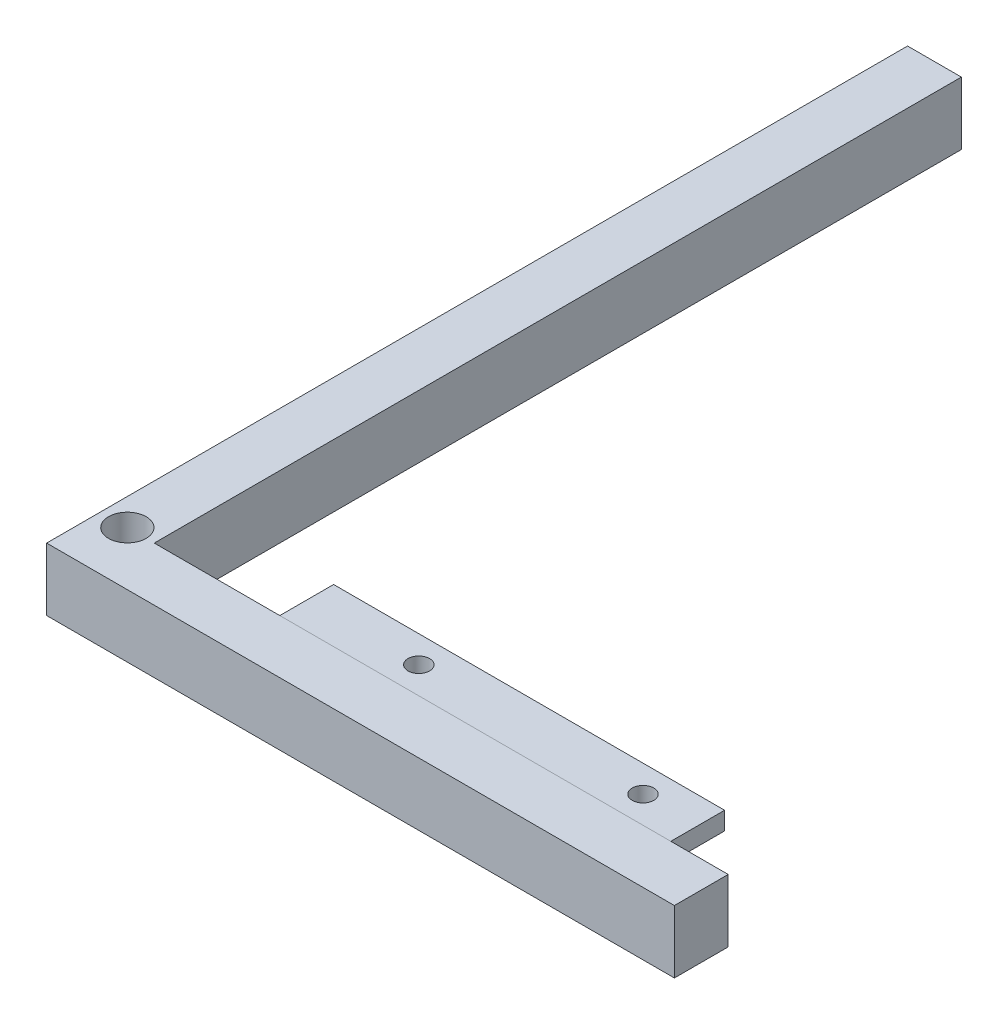
ISO-10303-21;
HEADER;
FILE_DESCRIPTION(('STEP AP214'),'2;1');
FILE_NAME('part.step','',(''),(''),'','','');
FILE_SCHEMA(('AUTOMOTIVE_DESIGN { 1 0 10303 214 1 1 1 1 }'));
ENDSEC;
DATA;
#1=APPLICATION_CONTEXT('core data for automotive mechanical design processes');
#2=APPLICATION_PROTOCOL_DEFINITION('international standard','automotive_design',2000,#1);
#3=PRODUCT_CONTEXT('',#1,'mechanical');
#4=PRODUCT('Part','Part','',(#3));
#5=PRODUCT_RELATED_PRODUCT_CATEGORY('part','',(#4));
#6=PRODUCT_DEFINITION_FORMATION('','',#4);
#7=PRODUCT_DEFINITION_CONTEXT('part definition',#1,'design');
#8=PRODUCT_DEFINITION('design','',#6,#7);
#9=PRODUCT_DEFINITION_SHAPE('','',#8);
#10=(LENGTH_UNIT() NAMED_UNIT(*) SI_UNIT(.MILLI.,.METRE.));
#11=(NAMED_UNIT(*) PLANE_ANGLE_UNIT() SI_UNIT($,.RADIAN.));
#12=(NAMED_UNIT(*) SI_UNIT($,.STERADIAN.) SOLID_ANGLE_UNIT());
#13=UNCERTAINTY_MEASURE_WITH_UNIT(LENGTH_MEASURE(1.E-05),#10,'distance_accuracy_value','');
#14=(GEOMETRIC_REPRESENTATION_CONTEXT(3) GLOBAL_UNCERTAINTY_ASSIGNED_CONTEXT((#13)) GLOBAL_UNIT_ASSIGNED_CONTEXT((#10,
#11,#12)) REPRESENTATION_CONTEXT('',''));
#15=CARTESIAN_POINT('',(0.,0.,0.));
#16=DIRECTION('',(0.,0.,1.));
#17=DIRECTION('',(1.,0.,0.));
#18=AXIS2_PLACEMENT_3D('',#15,#16,#17);
#19=CARTESIAN_POINT('',(0.,2.5,0.));
#20=DIRECTION('',(0.,-1.,0.));
#21=DIRECTION('',(0.,0.,-1.));
#22=AXIS2_PLACEMENT_3D('',#19,#20,#21);
#23=PLANE('',#22);
#24=CARTESIAN_POINT('',(-1.24999999999997,2.5,-3.00000089383693));
#25=DIRECTION('',(0.,-1.,0.));
#26=DIRECTION('',(0.,0.,-1.));
#27=AXIS2_PLACEMENT_3D('',#24,#25,#26);
#28=CIRCLE('',#27,0.6);
#29=CARTESIAN_POINT('',(-1.24999999999997,2.5,-3.60000089383693));
#30=VERTEX_POINT('',#29);
#31=EDGE_CURVE('E145',#30,#30,#28,.T.);
#32=ORIENTED_EDGE('',*,*,#31,.F.);
#33=EDGE_LOOP('',(#32));
#34=FACE_BOUND('',#33,.T.);
#35=DIRECTION('',(0.,0.,-1.));
#36=VECTOR('',#35,1.);
#37=CARTESIAN_POINT('',(-7.50000000000001,2.5,0.));
#38=LINE('',#37,#36);
#39=CARTESIAN_POINT('',(-7.50000000000001,2.5,-1.5));
#40=VERTEX_POINT('',#39);
#41=CARTESIAN_POINT('',(-7.50000000000001,2.5,-4.5));
#42=VERTEX_POINT('',#41);
#43=EDGE_CURVE('E129',#40,#42,#38,.T.);
#44=ORIENTED_EDGE('',*,*,#43,.T.);
#45=DIRECTION('',(1.,0.,0.));
#46=VECTOR('',#45,1.);
#47=CARTESIAN_POINT('',(0.,2.5,-4.5));
#48=LINE('',#47,#46);
#49=CARTESIAN_POINT('',(14.3,2.5,-4.5));
#50=VERTEX_POINT('',#49);
#51=EDGE_CURVE('E121',#42,#50,#48,.T.);
#52=ORIENTED_EDGE('',*,*,#51,.T.);
#53=DIRECTION('',(0.,0.,-1.));
#54=VECTOR('',#53,1.);
#55=CARTESIAN_POINT('',(14.3,2.5,0.));
#56=LINE('',#55,#54);
#57=CARTESIAN_POINT('',(14.3,2.5,-1.5));
#58=VERTEX_POINT('',#57);
#59=EDGE_CURVE('E128',#58,#50,#56,.T.);
#60=ORIENTED_EDGE('',*,*,#59,.F.);
#61=DIRECTION('',(1.,0.,0.));
#62=VECTOR('',#61,1.);
#63=CARTESIAN_POINT('',(0.,2.5,-1.5));
#64=LINE('',#63,#62);
#65=EDGE_CURVE('E138',#40,#58,#64,.T.);
#66=ORIENTED_EDGE('',*,*,#65,.F.);
#67=EDGE_LOOP('',(#44,#52,#60,#66));
#68=FACE_BOUND('',#67,.T.);
#69=CARTESIAN_POINT('',(11.25,2.5,-3.00000089383693));
#70=DIRECTION('',(0.,-1.,0.));
#71=DIRECTION('',(0.,0.,-1.));
#72=AXIS2_PLACEMENT_3D('',#69,#70,#71);
#73=CIRCLE('',#72,0.6);
#74=CARTESIAN_POINT('',(11.25,2.5,-3.60000089383693));
#75=VERTEX_POINT('',#74);
#76=EDGE_CURVE('E158',#75,#75,#73,.T.);
#77=ORIENTED_EDGE('',*,*,#76,.F.);
#78=EDGE_LOOP('',(#77));
#79=FACE_BOUND('',#78,.T.);
#80=ADVANCED_FACE('F79',(#34,#68,#79),#23,.T.);
#81=CARTESIAN_POINT('',(0.,3.5,0.));
#82=DIRECTION('',(0.,-1.,0.));
#83=DIRECTION('',(0.,0.,-1.));
#84=AXIS2_PLACEMENT_3D('',#81,#82,#83);
#85=PLANE('',#84);
#86=DIRECTION('',(0.,0.,-1.));
#87=VECTOR('',#86,1.);
#88=CARTESIAN_POINT('',(-7.50000000000001,3.5,0.));
#89=LINE('',#88,#87);
#90=CARTESIAN_POINT('',(-7.50000000000001,3.5,-1.5));
#91=VERTEX_POINT('',#90);
#92=CARTESIAN_POINT('',(-7.50000000000001,3.5,-4.5));
#93=VERTEX_POINT('',#92);
#94=EDGE_CURVE('E143',#91,#93,#89,.T.);
#95=ORIENTED_EDGE('',*,*,#94,.F.);
#96=DIRECTION('',(1.,0.,0.));
#97=VECTOR('',#96,1.);
#98=CARTESIAN_POINT('',(0.,3.5,-1.5));
#99=LINE('',#98,#97);
#100=CARTESIAN_POINT('',(14.3,3.5,-1.5));
#101=VERTEX_POINT('',#100);
#102=EDGE_CURVE('E149',#91,#101,#99,.T.);
#103=ORIENTED_EDGE('',*,*,#102,.T.);
#104=DIRECTION('',(0.,0.,-1.));
#105=VECTOR('',#104,1.);
#106=CARTESIAN_POINT('',(14.3,3.5,0.));
#107=LINE('',#106,#105);
#108=CARTESIAN_POINT('',(14.3,3.5,-4.5));
#109=VERTEX_POINT('',#108);
#110=EDGE_CURVE('E147',#101,#109,#107,.T.);
#111=ORIENTED_EDGE('',*,*,#110,.T.);
#112=DIRECTION('',(1.,0.,0.));
#113=VECTOR('',#112,1.);
#114=CARTESIAN_POINT('',(0.,3.5,-4.5));
#115=LINE('',#114,#113);
#116=EDGE_CURVE('E134',#93,#109,#115,.T.);
#117=ORIENTED_EDGE('',*,*,#116,.F.);
#118=EDGE_LOOP('',(#95,#103,#111,#117));
#119=FACE_BOUND('',#118,.T.);
#120=CARTESIAN_POINT('',(-1.24999999999997,3.5,-3.00000089383693));
#121=DIRECTION('',(0.,-1.,0.));
#122=DIRECTION('',(0.,0.,-1.));
#123=AXIS2_PLACEMENT_3D('',#120,#121,#122);
#124=CIRCLE('',#123,0.6);
#125=CARTESIAN_POINT('',(-1.24999999999997,3.5,-3.60000089383693));
#126=VERTEX_POINT('',#125);
#127=EDGE_CURVE('E155',#126,#126,#124,.T.);
#128=ORIENTED_EDGE('',*,*,#127,.T.);
#129=EDGE_LOOP('',(#128));
#130=FACE_BOUND('',#129,.T.);
#131=CARTESIAN_POINT('',(11.25,3.5,-3.00000089383693));
#132=DIRECTION('',(0.,-1.,0.));
#133=DIRECTION('',(0.,0.,-1.));
#134=AXIS2_PLACEMENT_3D('',#131,#132,#133);
#135=CIRCLE('',#134,0.6);
#136=CARTESIAN_POINT('',(11.25,3.5,-3.60000089383693));
#137=VERTEX_POINT('',#136);
#138=EDGE_CURVE('E161',#137,#137,#135,.T.);
#139=ORIENTED_EDGE('',*,*,#138,.T.);
#140=EDGE_LOOP('',(#139));
#141=FACE_BOUND('',#140,.T.);
#142=ADVANCED_FACE('F170',(#119,#130,#141),#85,.F.);
#143=CARTESIAN_POINT('',(-7.50000000000001,2.5,0.));
#144=DIRECTION('',(1.,0.,0.));
#145=DIRECTION('',(0.,0.,-1.));
#146=AXIS2_PLACEMENT_3D('',#143,#144,#145);
#147=PLANE('',#146);
#148=ORIENTED_EDGE('',*,*,#94,.T.);
#149=DIRECTION('',(0.,1.,0.));
#150=VECTOR('',#149,1.);
#151=CARTESIAN_POINT('',(-7.50000000000001,2.5,-4.5));
#152=LINE('',#151,#150);
#153=EDGE_CURVE('E13',#42,#93,#152,.T.);
#154=ORIENTED_EDGE('',*,*,#153,.F.);
#155=ORIENTED_EDGE('',*,*,#43,.F.);
#156=DIRECTION('',(0.,1.,0.));
#157=VECTOR('',#156,1.);
#158=CARTESIAN_POINT('',(-7.50000000000001,2.5,-1.5));
#159=LINE('',#158,#157);
#160=EDGE_CURVE('E96',#40,#91,#159,.T.);
#161=ORIENTED_EDGE('',*,*,#160,.T.);
#162=EDGE_LOOP('',(#148,#154,#155,#161));
#163=FACE_BOUND('',#162,.T.);
#164=ADVANCED_FACE('F81',(#163),#147,.F.);
#165=CARTESIAN_POINT('',(0.,2.5,-4.5));
#166=DIRECTION('',(0.,0.,1.));
#167=DIRECTION('',(1.,0.,0.));
#168=AXIS2_PLACEMENT_3D('',#165,#166,#167);
#169=PLANE('',#168);
#170=ORIENTED_EDGE('',*,*,#116,.T.);
#171=DIRECTION('',(0.,1.,0.));
#172=VECTOR('',#171,1.);
#173=CARTESIAN_POINT('',(14.3,2.5,-4.5));
#174=LINE('',#173,#172);
#175=EDGE_CURVE('E88',#50,#109,#174,.T.);
#176=ORIENTED_EDGE('',*,*,#175,.F.);
#177=ORIENTED_EDGE('',*,*,#51,.F.);
#178=ORIENTED_EDGE('',*,*,#153,.T.);
#179=EDGE_LOOP('',(#170,#176,#177,#178));
#180=FACE_BOUND('',#179,.T.);
#181=ADVANCED_FACE('F133',(#180),#169,.F.);
#182=CARTESIAN_POINT('',(14.3,2.5,0.));
#183=DIRECTION('',(1.,0.,0.));
#184=DIRECTION('',(0.,0.,-1.));
#185=AXIS2_PLACEMENT_3D('',#182,#183,#184);
#186=PLANE('',#185);
#187=ORIENTED_EDGE('',*,*,#110,.F.);
#188=DIRECTION('',(0.,1.,0.));
#189=VECTOR('',#188,1.);
#190=CARTESIAN_POINT('',(14.3,2.5,-1.5));
#191=LINE('',#190,#189);
#192=EDGE_CURVE('E110',#58,#101,#191,.T.);
#193=ORIENTED_EDGE('',*,*,#192,.F.);
#194=ORIENTED_EDGE('',*,*,#59,.T.);
#195=ORIENTED_EDGE('',*,*,#175,.T.);
#196=EDGE_LOOP('',(#187,#193,#194,#195));
#197=FACE_BOUND('',#196,.T.);
#198=ADVANCED_FACE('F137',(#197),#186,.T.);
#199=CARTESIAN_POINT('',(0.,2.5,-1.5));
#200=DIRECTION('',(0.,0.,1.));
#201=DIRECTION('',(1.,0.,0.));
#202=AXIS2_PLACEMENT_3D('',#199,#200,#201);
#203=PLANE('',#202);
#204=ORIENTED_EDGE('',*,*,#102,.F.);
#205=ORIENTED_EDGE('',*,*,#160,.F.);
#206=ORIENTED_EDGE('',*,*,#65,.T.);
#207=ORIENTED_EDGE('',*,*,#192,.T.);
#208=EDGE_LOOP('',(#204,#205,#206,#207));
#209=FACE_BOUND('',#208,.T.);
#210=ADVANCED_FACE('F182',(#209),#203,.T.);
#211=CARTESIAN_POINT('',(-1.24999999999997,2.5,-3.00000089383693));
#212=DIRECTION('',(0.,1.,0.));
#213=DIRECTION('',(0.,0.,1.));
#214=AXIS2_PLACEMENT_3D('',#211,#212,#213);
#215=CYLINDRICAL_SURFACE('',#214,0.6);
#216=ORIENTED_EDGE('',*,*,#31,.T.);
#217=EDGE_LOOP('',(#216));
#218=FACE_BOUND('',#217,.T.);
#219=ORIENTED_EDGE('',*,*,#127,.F.);
#220=EDGE_LOOP('',(#219));
#221=FACE_BOUND('',#220,.T.);
#222=ADVANCED_FACE('F179',(#218,#221),#215,.F.);
#223=CARTESIAN_POINT('',(11.25,2.5,-3.00000089383693));
#224=DIRECTION('',(0.,1.,0.));
#225=DIRECTION('',(0.,0.,1.));
#226=AXIS2_PLACEMENT_3D('',#223,#224,#225);
#227=CYLINDRICAL_SURFACE('',#226,0.6);
#228=ORIENTED_EDGE('',*,*,#76,.T.);
#229=EDGE_LOOP('',(#228));
#230=FACE_BOUND('',#229,.T.);
#231=ORIENTED_EDGE('',*,*,#138,.F.);
#232=EDGE_LOOP('',(#231));
#233=FACE_BOUND('',#232,.T.);
#234=ADVANCED_FACE('F167',(#230,#233),#227,.F.);
#235=CLOSED_SHELL('',(#80,#142,#164,#181,#198,#210,#222,#234));
#236=MANIFOLD_SOLID_BREP('B2',#235);
#237=CARTESIAN_POINT('',(-16.,0.,-1.5));
#238=DIRECTION('',(0.,1.,0.));
#239=DIRECTION('',(0.,0.,1.));
#240=AXIS2_PLACEMENT_3D('',#237,#238,#239);
#241=CYLINDRICAL_SURFACE('',#240,0.6);
#242=CARTESIAN_POINT('',(-16.,0.,-1.5));
#243=DIRECTION('',(0.,1.,0.));
#244=DIRECTION('',(0.,0.,1.));
#245=AXIS2_PLACEMENT_3D('',#242,#243,#244);
#246=CIRCLE('',#245,0.6);
#247=CARTESIAN_POINT('',(-16.,0.,-0.9));
#248=VERTEX_POINT('',#247);
#249=EDGE_CURVE('E401',#248,#248,#246,.T.);
#250=ORIENTED_EDGE('',*,*,#249,.F.);
#251=EDGE_LOOP('',(#250));
#252=FACE_BOUND('',#251,.T.);
#253=CARTESIAN_POINT('',(-16.,2.,-1.5));
#254=DIRECTION('',(0.,1.,0.));
#255=DIRECTION('',(0.,0.,1.));
#256=AXIS2_PLACEMENT_3D('',#253,#254,#255);
#257=CIRCLE('',#256,0.6);
#258=CARTESIAN_POINT('',(-16.,2.,-0.9));
#259=VERTEX_POINT('',#258);
#260=EDGE_CURVE('E277',#259,#259,#257,.F.);
#261=ORIENTED_EDGE('',*,*,#260,.F.);
#262=EDGE_LOOP('',(#261));
#263=FACE_BOUND('',#262,.T.);
#264=ADVANCED_FACE('F273',(#252,#263),#241,.F.);
#265=CARTESIAN_POINT('',(-17.5,3.5,1.5));
#266=DIRECTION('',(-1.,0.,0.));
#267=DIRECTION('',(0.,0.,1.));
#268=AXIS2_PLACEMENT_3D('',#265,#266,#267);
#269=PLANE('',#268);
#270=DIRECTION('',(0.,0.,-1.));
#271=VECTOR('',#270,1.);
#272=CARTESIAN_POINT('',(-17.5,0.,1.5));
#273=LINE('',#272,#271);
#274=CARTESIAN_POINT('',(-17.5,0.,1.5));
#275=VERTEX_POINT('',#274);
#276=CARTESIAN_POINT('',(-17.5,0.,-46.5000000000001));
#277=VERTEX_POINT('',#276);
#278=EDGE_CURVE('E458',#275,#277,#273,.T.);
#279=ORIENTED_EDGE('',*,*,#278,.F.);
#280=DIRECTION('',(0.,-1.,0.));
#281=VECTOR('',#280,1.);
#282=CARTESIAN_POINT('',(-17.5,3.5,1.5));
#283=LINE('',#282,#281);
#284=CARTESIAN_POINT('',(-17.5,3.5,1.5));
#285=VERTEX_POINT('',#284);
#286=EDGE_CURVE('E282',#285,#275,#283,.T.);
#287=ORIENTED_EDGE('',*,*,#286,.F.);
#288=DIRECTION('',(0.,0.,-1.));
#289=VECTOR('',#288,1.);
#290=CARTESIAN_POINT('',(-17.5,3.5,1.5));
#291=LINE('',#290,#289);
#292=CARTESIAN_POINT('',(-17.5,3.5,-46.5000000000001));
#293=VERTEX_POINT('',#292);
#294=EDGE_CURVE('E447',#285,#293,#291,.T.);
#295=ORIENTED_EDGE('',*,*,#294,.T.);
#296=DIRECTION('',(0.,-1.,0.));
#297=VECTOR('',#296,1.);
#298=CARTESIAN_POINT('',(-17.5,3.5,-46.5000000000001));
#299=LINE('',#298,#297);
#300=EDGE_CURVE('E479',#293,#277,#299,.T.);
#301=ORIENTED_EDGE('',*,*,#300,.T.);
#302=EDGE_LOOP('',(#279,#287,#295,#301));
#303=FACE_BOUND('',#302,.T.);
#304=ADVANCED_FACE('F489',(#303),#269,.T.);
#305=CARTESIAN_POINT('',(-17.5,3.5,1.5));
#306=DIRECTION('',(0.,0.,-1.));
#307=DIRECTION('',(-1.,0.,0.));
#308=AXIS2_PLACEMENT_3D('',#305,#306,#307);
#309=PLANE('',#308);
#310=DIRECTION('',(1.,0.,0.));
#311=VECTOR('',#310,1.);
#312=CARTESIAN_POINT('',(-17.5,0.,1.5));
#313=LINE('',#312,#311);
#314=CARTESIAN_POINT('',(17.5,0.,1.5));
#315=VERTEX_POINT('',#314);
#316=EDGE_CURVE('E450',#275,#315,#313,.T.);
#317=ORIENTED_EDGE('',*,*,#316,.T.);
#318=DIRECTION('',(0.,-1.,0.));
#319=VECTOR('',#318,1.);
#320=CARTESIAN_POINT('',(17.5,3.5,1.5));
#321=LINE('',#320,#319);
#322=CARTESIAN_POINT('',(17.5,3.5,1.5));
#323=VERTEX_POINT('',#322);
#324=EDGE_CURVE('E468',#323,#315,#321,.T.);
#325=ORIENTED_EDGE('',*,*,#324,.F.);
#326=DIRECTION('',(1.,0.,0.));
#327=VECTOR('',#326,1.);
#328=CARTESIAN_POINT('',(-17.5,3.5,1.5));
#329=LINE('',#328,#327);
#330=EDGE_CURVE('E455',#285,#323,#329,.T.);
#331=ORIENTED_EDGE('',*,*,#330,.F.);
#332=ORIENTED_EDGE('',*,*,#286,.T.);
#333=EDGE_LOOP('',(#317,#325,#331,#332));
#334=FACE_BOUND('',#333,.T.);
#335=ADVANCED_FACE('F502',(#334),#309,.F.);
#336=CARTESIAN_POINT('',(17.5,3.5,1.5));
#337=DIRECTION('',(-1.,0.,0.));
#338=DIRECTION('',(0.,0.,1.));
#339=AXIS2_PLACEMENT_3D('',#336,#337,#338);
#340=PLANE('',#339);
#341=DIRECTION('',(0.,0.,-1.));
#342=VECTOR('',#341,1.);
#343=CARTESIAN_POINT('',(17.5,0.,1.5));
#344=LINE('',#343,#342);
#345=CARTESIAN_POINT('',(17.5,0.,-1.5));
#346=VERTEX_POINT('',#345);
#347=EDGE_CURVE('E463',#315,#346,#344,.T.);
#348=ORIENTED_EDGE('',*,*,#347,.T.);
#349=DIRECTION('',(0.,-1.,0.));
#350=VECTOR('',#349,1.);
#351=CARTESIAN_POINT('',(17.5,3.5,-1.5));
#352=LINE('',#351,#350);
#353=CARTESIAN_POINT('',(17.5,3.5,-1.5));
#354=VERTEX_POINT('',#353);
#355=EDGE_CURVE('E457',#354,#346,#352,.T.);
#356=ORIENTED_EDGE('',*,*,#355,.F.);
#357=DIRECTION('',(0.,0.,-1.));
#358=VECTOR('',#357,1.);
#359=CARTESIAN_POINT('',(17.5,3.5,1.5));
#360=LINE('',#359,#358);
#361=EDGE_CURVE('E452',#323,#354,#360,.T.);
#362=ORIENTED_EDGE('',*,*,#361,.F.);
#363=ORIENTED_EDGE('',*,*,#324,.T.);
#364=EDGE_LOOP('',(#348,#356,#362,#363));
#365=FACE_BOUND('',#364,.T.);
#366=ADVANCED_FACE('F506',(#365),#340,.F.);
#367=CARTESIAN_POINT('',(-17.5,3.5,-1.5));
#368=DIRECTION('',(0.,0.,-1.));
#369=DIRECTION('',(-1.,0.,0.));
#370=AXIS2_PLACEMENT_3D('',#367,#368,#369);
#371=PLANE('',#370);
#372=DIRECTION('',(0.,-1.,0.));
#373=VECTOR('',#372,1.);
#374=CARTESIAN_POINT('',(-14.5,3.5,-1.5));
#375=LINE('',#374,#373);
#376=CARTESIAN_POINT('',(-14.5,3.5,-1.5));
#377=VERTEX_POINT('',#376);
#378=CARTESIAN_POINT('',(-14.5,0.,-1.5));
#379=VERTEX_POINT('',#378);
#380=EDGE_CURVE('E77',#377,#379,#375,.T.);
#381=ORIENTED_EDGE('',*,*,#380,.F.);
#382=DIRECTION('',(1.,0.,0.));
#383=VECTOR('',#382,1.);
#384=CARTESIAN_POINT('',(-17.5,3.5,-1.5));
#385=LINE('',#384,#383);
#386=EDGE_CURVE('E449',#377,#354,#385,.T.);
#387=ORIENTED_EDGE('',*,*,#386,.T.);
#388=ORIENTED_EDGE('',*,*,#355,.T.);
#389=DIRECTION('',(1.,0.,0.));
#390=VECTOR('',#389,1.);
#391=CARTESIAN_POINT('',(-17.5,0.,-1.5));
#392=LINE('',#391,#390);
#393=EDGE_CURVE('E460',#379,#346,#392,.T.);
#394=ORIENTED_EDGE('',*,*,#393,.F.);
#395=EDGE_LOOP('',(#381,#387,#388,#394));
#396=FACE_BOUND('',#395,.T.);
#397=ADVANCED_FACE('F515',(#396),#371,.T.);
#398=CARTESIAN_POINT('',(0.,3.5,0.));
#399=DIRECTION('',(0.,-1.,0.));
#400=DIRECTION('',(0.,0.,-1.));
#401=AXIS2_PLACEMENT_3D('',#398,#399,#400);
#402=PLANE('',#401);
#403=CARTESIAN_POINT('',(-16.,3.5,-1.5));
#404=DIRECTION('',(0.,1.,0.));
#405=DIRECTION('',(0.,0.,1.));
#406=AXIS2_PLACEMENT_3D('',#403,#404,#405);
#407=CIRCLE('',#406,1.05);
#408=CARTESIAN_POINT('',(-16.,3.5,-0.45));
#409=VERTEX_POINT('',#408);
#410=EDGE_CURVE('E726',#409,#409,#407,.T.);
#411=ORIENTED_EDGE('',*,*,#410,.F.);
#412=EDGE_LOOP('',(#411));
#413=FACE_BOUND('',#412,.T.);
#414=ORIENTED_EDGE('',*,*,#294,.F.);
#415=ORIENTED_EDGE('',*,*,#330,.T.);
#416=ORIENTED_EDGE('',*,*,#361,.T.);
#417=ORIENTED_EDGE('',*,*,#386,.F.);
#418=DIRECTION('',(0.,0.,-1.));
#419=VECTOR('',#418,1.);
#420=CARTESIAN_POINT('',(-14.5,3.5,-1.5));
#421=LINE('',#420,#419);
#422=CARTESIAN_POINT('',(-14.5,3.5,-46.5000000000001));
#423=VERTEX_POINT('',#422);
#424=EDGE_CURVE('E476',#377,#423,#421,.T.);
#425=ORIENTED_EDGE('',*,*,#424,.T.);
#426=DIRECTION('',(1.,0.,0.));
#427=VECTOR('',#426,1.);
#428=CARTESIAN_POINT('',(-17.5,3.5,-46.5000000000001));
#429=LINE('',#428,#427);
#430=EDGE_CURVE('E473',#293,#423,#429,.T.);
#431=ORIENTED_EDGE('',*,*,#430,.F.);
#432=EDGE_LOOP('',(#414,#415,#416,#417,#425,#431));
#433=FACE_BOUND('',#432,.T.);
#434=ADVANCED_FACE('F510',(#413,#433),#402,.F.);
#435=CARTESIAN_POINT('',(0.,0.,0.));
#436=DIRECTION('',(0.,-1.,0.));
#437=DIRECTION('',(0.,0.,-1.));
#438=AXIS2_PLACEMENT_3D('',#435,#436,#437);
#439=PLANE('',#438);
#440=ORIENTED_EDGE('',*,*,#249,.T.);
#441=EDGE_LOOP('',(#440));
#442=FACE_BOUND('',#441,.T.);
#443=DIRECTION('',(1.,0.,0.));
#444=VECTOR('',#443,1.);
#445=CARTESIAN_POINT('',(-15.5,0.,-44.8000000000001));
#446=LINE('',#445,#444);
#447=CARTESIAN_POINT('',(-16.5,0.,-44.8000000000001));
#448=VERTEX_POINT('',#447);
#449=CARTESIAN_POINT('',(-15.5,0.,-44.8000000000001));
#450=VERTEX_POINT('',#449);
#451=EDGE_CURVE('E290',#448,#450,#446,.T.);
#452=ORIENTED_EDGE('',*,*,#451,.F.);
#453=DIRECTION('',(0.,0.,-1.));
#454=VECTOR('',#453,1.);
#455=CARTESIAN_POINT('',(-16.5,0.,-44.8000000000001));
#456=LINE('',#455,#454);
#457=CARTESIAN_POINT('',(-16.5,0.,-3.));
#458=VERTEX_POINT('',#457);
#459=EDGE_CURVE('E395',#458,#448,#456,.T.);
#460=ORIENTED_EDGE('',*,*,#459,.F.);
#461=DIRECTION('',(-1.,0.,0.));
#462=VECTOR('',#461,1.);
#463=CARTESIAN_POINT('',(-16.5,0.,-3.));
#464=LINE('',#463,#462);
#465=CARTESIAN_POINT('',(-15.5000000000002,0.,-3.));
#466=VERTEX_POINT('',#465);
#467=EDGE_CURVE('E398',#466,#458,#464,.T.);
#468=ORIENTED_EDGE('',*,*,#467,.F.);
#469=DIRECTION('',(0.,0.,1.));
#470=VECTOR('',#469,1.);
#471=CARTESIAN_POINT('',(-15.5000000000002,0.,-3.));
#472=LINE('',#471,#470);
#473=EDGE_CURVE('E407',#450,#466,#472,.T.);
#474=ORIENTED_EDGE('',*,*,#473,.F.);
#475=EDGE_LOOP('',(#452,#460,#468,#474));
#476=FACE_BOUND('',#475,.T.);
#477=DIRECTION('',(1.,0.,0.));
#478=VECTOR('',#477,1.);
#479=CARTESIAN_POINT('',(16.,0.,-0.499999999999992));
#480=LINE('',#479,#478);
#481=CARTESIAN_POINT('',(-16.,0.,-0.499999999999997));
#482=VERTEX_POINT('',#481);
#483=CARTESIAN_POINT('',(16.,0.,-0.499999999999992));
#484=VERTEX_POINT('',#483);
#485=EDGE_CURVE('E298',#482,#484,#480,.T.);
#486=ORIENTED_EDGE('',*,*,#485,.F.);
#487=DIRECTION('',(0.,0.,-1.));
#488=VECTOR('',#487,1.);
#489=CARTESIAN_POINT('',(-16.,0.,-0.499999999999997));
#490=LINE('',#489,#488);
#491=CARTESIAN_POINT('',(-16.,0.,0.5));
#492=VERTEX_POINT('',#491);
#493=EDGE_CURVE('E426',#492,#482,#490,.T.);
#494=ORIENTED_EDGE('',*,*,#493,.F.);
#495=DIRECTION('',(-1.,0.,0.));
#496=VECTOR('',#495,1.);
#497=CARTESIAN_POINT('',(-16.,0.,0.5));
#498=LINE('',#497,#496);
#499=CARTESIAN_POINT('',(16.,0.,0.500000000000007));
#500=VERTEX_POINT('',#499);
#501=EDGE_CURVE('E429',#500,#492,#498,.T.);
#502=ORIENTED_EDGE('',*,*,#501,.F.);
#503=DIRECTION('',(0.,0.,1.));
#504=VECTOR('',#503,1.);
#505=CARTESIAN_POINT('',(16.,0.,0.500000000000007));
#506=LINE('',#505,#504);
#507=EDGE_CURVE('E433',#484,#500,#506,.T.);
#508=ORIENTED_EDGE('',*,*,#507,.F.);
#509=EDGE_LOOP('',(#486,#494,#502,#508));
#510=FACE_BOUND('',#509,.T.);
#511=ORIENTED_EDGE('',*,*,#278,.T.);
#512=DIRECTION('',(1.,0.,0.));
#513=VECTOR('',#512,1.);
#514=CARTESIAN_POINT('',(-17.5,0.,-46.5000000000001));
#515=LINE('',#514,#513);
#516=CARTESIAN_POINT('',(-14.5,0.,-46.5000000000001));
#517=VERTEX_POINT('',#516);
#518=EDGE_CURVE('E413',#277,#517,#515,.T.);
#519=ORIENTED_EDGE('',*,*,#518,.T.);
#520=DIRECTION('',(0.,0.,-1.));
#521=VECTOR('',#520,1.);
#522=CARTESIAN_POINT('',(-14.5,0.,-1.5));
#523=LINE('',#522,#521);
#524=EDGE_CURVE('E477',#379,#517,#523,.T.);
#525=ORIENTED_EDGE('',*,*,#524,.F.);
#526=ORIENTED_EDGE('',*,*,#393,.T.);
#527=ORIENTED_EDGE('',*,*,#347,.F.);
#528=ORIENTED_EDGE('',*,*,#316,.F.);
#529=EDGE_LOOP('',(#511,#519,#525,#526,#527,#528));
#530=FACE_BOUND('',#529,.T.);
#531=ADVANCED_FACE('F496',(#442,#476,#510,#530),#439,.T.);
#532=CARTESIAN_POINT('',(-17.5,3.5,-46.5000000000001));
#533=DIRECTION('',(0.,0.,-1.));
#534=DIRECTION('',(-1.,0.,0.));
#535=AXIS2_PLACEMENT_3D('',#532,#533,#534);
#536=PLANE('',#535);
#537=ORIENTED_EDGE('',*,*,#518,.F.);
#538=ORIENTED_EDGE('',*,*,#300,.F.);
#539=ORIENTED_EDGE('',*,*,#430,.T.);
#540=DIRECTION('',(0.,-1.,0.));
#541=VECTOR('',#540,1.);
#542=CARTESIAN_POINT('',(-14.5,3.5,-46.5000000000001));
#543=LINE('',#542,#541);
#544=EDGE_CURVE('E461',#423,#517,#543,.T.);
#545=ORIENTED_EDGE('',*,*,#544,.T.);
#546=EDGE_LOOP('',(#537,#538,#539,#545));
#547=FACE_BOUND('',#546,.T.);
#548=ADVANCED_FACE('F275',(#547),#536,.T.);
#549=CARTESIAN_POINT('',(-14.5,3.5,-1.5));
#550=DIRECTION('',(-1.,0.,0.));
#551=DIRECTION('',(0.,0.,1.));
#552=AXIS2_PLACEMENT_3D('',#549,#550,#551);
#553=PLANE('',#552);
#554=ORIENTED_EDGE('',*,*,#524,.T.);
#555=ORIENTED_EDGE('',*,*,#544,.F.);
#556=ORIENTED_EDGE('',*,*,#424,.F.);
#557=ORIENTED_EDGE('',*,*,#380,.T.);
#558=EDGE_LOOP('',(#554,#555,#556,#557));
#559=FACE_BOUND('',#558,.T.);
#560=ADVANCED_FACE('F513',(#559),#553,.F.);
#561=CARTESIAN_POINT('',(16.,1.5,-0.499999999999992));
#562=DIRECTION('',(0.,0.,-1.));
#563=DIRECTION('',(-1.,0.,0.));
#564=AXIS2_PLACEMENT_3D('',#561,#562,#563);
#565=PLANE('',#564);
#566=ORIENTED_EDGE('',*,*,#485,.T.);
#567=DIRECTION('',(0.,-1.,0.));
#568=VECTOR('',#567,1.);
#569=CARTESIAN_POINT('',(16.,1.5,-0.499999999999992));
#570=LINE('',#569,#568);
#571=CARTESIAN_POINT('',(16.,1.5,-0.499999999999992));
#572=VERTEX_POINT('',#571);
#573=EDGE_CURVE('E417',#572,#484,#570,.T.);
#574=ORIENTED_EDGE('',*,*,#573,.F.);
#575=DIRECTION('',(1.,0.,0.));
#576=VECTOR('',#575,1.);
#577=CARTESIAN_POINT('',(16.,1.5,-0.499999999999992));
#578=LINE('',#577,#576);
#579=CARTESIAN_POINT('',(-16.,1.5,-0.499999999999997));
#580=VERTEX_POINT('',#579);
#581=EDGE_CURVE('E430',#580,#572,#578,.T.);
#582=ORIENTED_EDGE('',*,*,#581,.F.);
#583=DIRECTION('',(0.,-1.,0.));
#584=VECTOR('',#583,1.);
#585=CARTESIAN_POINT('',(-16.,1.5,-0.499999999999997));
#586=LINE('',#585,#584);
#587=EDGE_CURVE('E424',#580,#482,#586,.T.);
#588=ORIENTED_EDGE('',*,*,#587,.T.);
#589=EDGE_LOOP('',(#566,#574,#582,#588));
#590=FACE_BOUND('',#589,.T.);
#591=ADVANCED_FACE('F537',(#590),#565,.F.);
#592=CARTESIAN_POINT('',(-16.,1.5,-0.499999999999997));
#593=DIRECTION('',(-1.,0.,0.));
#594=DIRECTION('',(0.,0.,1.));
#595=AXIS2_PLACEMENT_3D('',#592,#593,#594);
#596=PLANE('',#595);
#597=ORIENTED_EDGE('',*,*,#493,.T.);
#598=ORIENTED_EDGE('',*,*,#587,.F.);
#599=DIRECTION('',(0.,0.,-1.));
#600=VECTOR('',#599,1.);
#601=CARTESIAN_POINT('',(-16.,1.5,-0.499999999999997));
#602=LINE('',#601,#600);
#603=CARTESIAN_POINT('',(-16.,1.5,0.5));
#604=VERTEX_POINT('',#603);
#605=EDGE_CURVE('E419',#604,#580,#602,.T.);
#606=ORIENTED_EDGE('',*,*,#605,.F.);
#607=DIRECTION('',(0.,-1.,0.));
#608=VECTOR('',#607,1.);
#609=CARTESIAN_POINT('',(-16.,1.5,0.5));
#610=LINE('',#609,#608);
#611=EDGE_CURVE('E422',#604,#492,#610,.T.);
#612=ORIENTED_EDGE('',*,*,#611,.T.);
#613=EDGE_LOOP('',(#597,#598,#606,#612));
#614=FACE_BOUND('',#613,.T.);
#615=ADVANCED_FACE('F542',(#614),#596,.F.);
#616=CARTESIAN_POINT('',(-16.,1.5,0.5));
#617=DIRECTION('',(0.,0.,1.));
#618=DIRECTION('',(1.,0.,0.));
#619=AXIS2_PLACEMENT_3D('',#616,#617,#618);
#620=PLANE('',#619);
#621=ORIENTED_EDGE('',*,*,#501,.T.);
#622=ORIENTED_EDGE('',*,*,#611,.F.);
#623=DIRECTION('',(-1.,0.,0.));
#624=VECTOR('',#623,1.);
#625=CARTESIAN_POINT('',(-16.,1.5,0.5));
#626=LINE('',#625,#624);
#627=CARTESIAN_POINT('',(16.,1.5,0.500000000000007));
#628=VERTEX_POINT('',#627);
#629=EDGE_CURVE('E439',#628,#604,#626,.T.);
#630=ORIENTED_EDGE('',*,*,#629,.F.);
#631=DIRECTION('',(0.,-1.,0.));
#632=VECTOR('',#631,1.);
#633=CARTESIAN_POINT('',(16.,1.5,0.500000000000007));
#634=LINE('',#633,#632);
#635=EDGE_CURVE('E420',#628,#500,#634,.T.);
#636=ORIENTED_EDGE('',*,*,#635,.T.);
#637=EDGE_LOOP('',(#621,#622,#630,#636));
#638=FACE_BOUND('',#637,.T.);
#639=ADVANCED_FACE('F598',(#638),#620,.F.);
#640=CARTESIAN_POINT('',(16.,1.5,0.500000000000007));
#641=DIRECTION('',(1.,0.,0.));
#642=DIRECTION('',(0.,0.,-1.));
#643=AXIS2_PLACEMENT_3D('',#640,#641,#642);
#644=PLANE('',#643);
#645=ORIENTED_EDGE('',*,*,#507,.T.);
#646=ORIENTED_EDGE('',*,*,#635,.F.);
#647=DIRECTION('',(0.,0.,1.));
#648=VECTOR('',#647,1.);
#649=CARTESIAN_POINT('',(16.,1.5,0.500000000000007));
#650=LINE('',#649,#648);
#651=EDGE_CURVE('E442',#572,#628,#650,.T.);
#652=ORIENTED_EDGE('',*,*,#651,.F.);
#653=ORIENTED_EDGE('',*,*,#573,.T.);
#654=EDGE_LOOP('',(#645,#646,#652,#653));
#655=FACE_BOUND('',#654,.T.);
#656=ADVANCED_FACE('F609',(#655),#644,.F.);
#657=CARTESIAN_POINT('',(0.,1.5,0.));
#658=DIRECTION('',(0.,1.,0.));
#659=DIRECTION('',(0.,0.,1.));
#660=AXIS2_PLACEMENT_3D('',#657,#658,#659);
#661=PLANE('',#660);
#662=ORIENTED_EDGE('',*,*,#581,.T.);
#663=ORIENTED_EDGE('',*,*,#651,.T.);
#664=ORIENTED_EDGE('',*,*,#629,.T.);
#665=ORIENTED_EDGE('',*,*,#605,.T.);
#666=EDGE_LOOP('',(#662,#663,#664,#665));
#667=FACE_BOUND('',#666,.T.);
#668=ADVANCED_FACE('F620',(#667),#661,.F.);
#669=CARTESIAN_POINT('',(-15.5,1.5,-44.8000000000001));
#670=DIRECTION('',(0.,0.,-1.));
#671=DIRECTION('',(-1.,0.,0.));
#672=AXIS2_PLACEMENT_3D('',#669,#670,#671);
#673=PLANE('',#672);
#674=ORIENTED_EDGE('',*,*,#451,.T.);
#675=DIRECTION('',(0.,-1.,0.));
#676=VECTOR('',#675,1.);
#677=CARTESIAN_POINT('',(-15.5,1.5,-44.8000000000001));
#678=LINE('',#677,#676);
#679=CARTESIAN_POINT('',(-15.5,1.5,-44.8000000000001));
#680=VERTEX_POINT('',#679);
#681=EDGE_CURVE('E373',#680,#450,#678,.T.);
#682=ORIENTED_EDGE('',*,*,#681,.F.);
#683=DIRECTION('',(1.,0.,0.));
#684=VECTOR('',#683,1.);
#685=CARTESIAN_POINT('',(-15.5,1.5,-44.8000000000001));
#686=LINE('',#685,#684);
#687=CARTESIAN_POINT('',(-16.5,1.5,-44.8000000000001));
#688=VERTEX_POINT('',#687);
#689=EDGE_CURVE('E377',#688,#680,#686,.T.);
#690=ORIENTED_EDGE('',*,*,#689,.F.);
#691=DIRECTION('',(0.,-1.,0.));
#692=VECTOR('',#691,1.);
#693=CARTESIAN_POINT('',(-16.5,1.5,-44.8000000000001));
#694=LINE('',#693,#692);
#695=EDGE_CURVE('E411',#688,#448,#694,.T.);
#696=ORIENTED_EDGE('',*,*,#695,.T.);
#697=EDGE_LOOP('',(#674,#682,#690,#696));
#698=FACE_BOUND('',#697,.T.);
#699=ADVANCED_FACE('F375',(#698),#673,.F.);
#700=CARTESIAN_POINT('',(-16.5,1.5,-44.8000000000001));
#701=DIRECTION('',(-1.,0.,0.));
#702=DIRECTION('',(0.,0.,1.));
#703=AXIS2_PLACEMENT_3D('',#700,#701,#702);
#704=PLANE('',#703);
#705=ORIENTED_EDGE('',*,*,#459,.T.);
#706=ORIENTED_EDGE('',*,*,#695,.F.);
#707=DIRECTION('',(0.,0.,-1.));
#708=VECTOR('',#707,1.);
#709=CARTESIAN_POINT('',(-16.5,1.5,-44.8000000000001));
#710=LINE('',#709,#708);
#711=CARTESIAN_POINT('',(-16.5,1.5,-3.));
#712=VERTEX_POINT('',#711);
#713=EDGE_CURVE('E383',#712,#688,#710,.T.);
#714=ORIENTED_EDGE('',*,*,#713,.F.);
#715=DIRECTION('',(0.,-1.,0.));
#716=VECTOR('',#715,1.);
#717=CARTESIAN_POINT('',(-16.5,1.5,-3.));
#718=LINE('',#717,#716);
#719=EDGE_CURVE('E414',#712,#458,#718,.T.);
#720=ORIENTED_EDGE('',*,*,#719,.T.);
#721=EDGE_LOOP('',(#705,#706,#714,#720));
#722=FACE_BOUND('',#721,.T.);
#723=ADVANCED_FACE('F640',(#722),#704,.F.);
#724=CARTESIAN_POINT('',(-16.5,1.5,-3.));
#725=DIRECTION('',(0.,0.,1.));
#726=DIRECTION('',(1.,0.,0.));
#727=AXIS2_PLACEMENT_3D('',#724,#725,#726);
#728=PLANE('',#727);
#729=ORIENTED_EDGE('',*,*,#467,.T.);
#730=ORIENTED_EDGE('',*,*,#719,.F.);
#731=DIRECTION('',(-1.,0.,0.));
#732=VECTOR('',#731,1.);
#733=CARTESIAN_POINT('',(-16.5,1.5,-3.));
#734=LINE('',#733,#732);
#735=CARTESIAN_POINT('',(-15.5000000000002,1.5,-3.));
#736=VERTEX_POINT('',#735);
#737=EDGE_CURVE('E391',#736,#712,#734,.T.);
#738=ORIENTED_EDGE('',*,*,#737,.F.);
#739=DIRECTION('',(0.,-1.,0.));
#740=VECTOR('',#739,1.);
#741=CARTESIAN_POINT('',(-15.5000000000002,1.5,-3.));
#742=LINE('',#741,#740);
#743=EDGE_CURVE('E382',#736,#466,#742,.T.);
#744=ORIENTED_EDGE('',*,*,#743,.T.);
#745=EDGE_LOOP('',(#729,#730,#738,#744));
#746=FACE_BOUND('',#745,.T.);
#747=ADVANCED_FACE('F650',(#746),#728,.F.);
#748=CARTESIAN_POINT('',(-15.5000000000002,1.5,-3.));
#749=DIRECTION('',(1.,0.,0.));
#750=DIRECTION('',(0.,0.,-1.));
#751=AXIS2_PLACEMENT_3D('',#748,#749,#750);
#752=PLANE('',#751);
#753=ORIENTED_EDGE('',*,*,#473,.T.);
#754=ORIENTED_EDGE('',*,*,#743,.F.);
#755=DIRECTION('',(0.,0.,1.));
#756=VECTOR('',#755,1.);
#757=CARTESIAN_POINT('',(-15.5000000000002,1.5,-3.));
#758=LINE('',#757,#756);
#759=EDGE_CURVE('E386',#680,#736,#758,.T.);
#760=ORIENTED_EDGE('',*,*,#759,.F.);
#761=ORIENTED_EDGE('',*,*,#681,.T.);
#762=EDGE_LOOP('',(#753,#754,#760,#761));
#763=FACE_BOUND('',#762,.T.);
#764=ADVANCED_FACE('F387',(#763),#752,.F.);
#765=CARTESIAN_POINT('',(0.,1.5,0.));
#766=DIRECTION('',(0.,1.,0.));
#767=DIRECTION('',(0.,0.,1.));
#768=AXIS2_PLACEMENT_3D('',#765,#766,#767);
#769=PLANE('',#768);
#770=ORIENTED_EDGE('',*,*,#689,.T.);
#771=ORIENTED_EDGE('',*,*,#759,.T.);
#772=ORIENTED_EDGE('',*,*,#737,.T.);
#773=ORIENTED_EDGE('',*,*,#713,.T.);
#774=EDGE_LOOP('',(#770,#771,#772,#773));
#775=FACE_BOUND('',#774,.T.);
#776=ADVANCED_FACE('F393',(#775),#769,.F.);
#777=CARTESIAN_POINT('',(-16.,2.,-1.5));
#778=DIRECTION('',(0.,1.,0.));
#779=DIRECTION('',(0.,0.,1.));
#780=AXIS2_PLACEMENT_3D('',#777,#778,#779);
#781=PLANE('',#780);
#782=CARTESIAN_POINT('',(-16.,2.,-1.5));
#783=DIRECTION('',(0.,1.,0.));
#784=DIRECTION('',(0.,0.,1.));
#785=AXIS2_PLACEMENT_3D('',#782,#783,#784);
#786=CIRCLE('',#785,1.05);
#787=CARTESIAN_POINT('',(-16.,2.,-0.45));
#788=VERTEX_POINT('',#787);
#789=EDGE_CURVE('E723',#788,#788,#786,.T.);
#790=ORIENTED_EDGE('',*,*,#789,.T.);
#791=EDGE_LOOP('',(#790));
#792=FACE_BOUND('',#791,.T.);
#793=ORIENTED_EDGE('',*,*,#260,.T.);
#794=EDGE_LOOP('',(#793));
#795=FACE_BOUND('',#794,.T.);
#796=ADVANCED_FACE('F679',(#792,#795),#781,.T.);
#797=CARTESIAN_POINT('',(-16.,2.,-1.5));
#798=DIRECTION('',(0.,1.,0.));
#799=DIRECTION('',(0.,0.,1.));
#800=AXIS2_PLACEMENT_3D('',#797,#798,#799);
#801=CYLINDRICAL_SURFACE('',#800,1.05);
#802=ORIENTED_EDGE('',*,*,#789,.F.);
#803=EDGE_LOOP('',(#802));
#804=FACE_BOUND('',#803,.T.);
#805=ORIENTED_EDGE('',*,*,#410,.T.);
#806=EDGE_LOOP('',(#805));
#807=FACE_BOUND('',#806,.T.);
#808=ADVANCED_FACE('F704',(#804,#807),#801,.F.);
#809=CLOSED_SHELL('',(#264,#304,#335,#366,#397,#434,#531,#548,#560,#591,#615,#639,#656,#668,
#699,#723,#747,#764,#776,#796,#808));
#810=MANIFOLD_SOLID_BREP('B7',#809);
#811=ADVANCED_BREP_SHAPE_REPRESENTATION('',(#18,#236,#810),#14);
#812=SHAPE_DEFINITION_REPRESENTATION(#9,#811);
ENDSEC;
END-ISO-10303-21;
